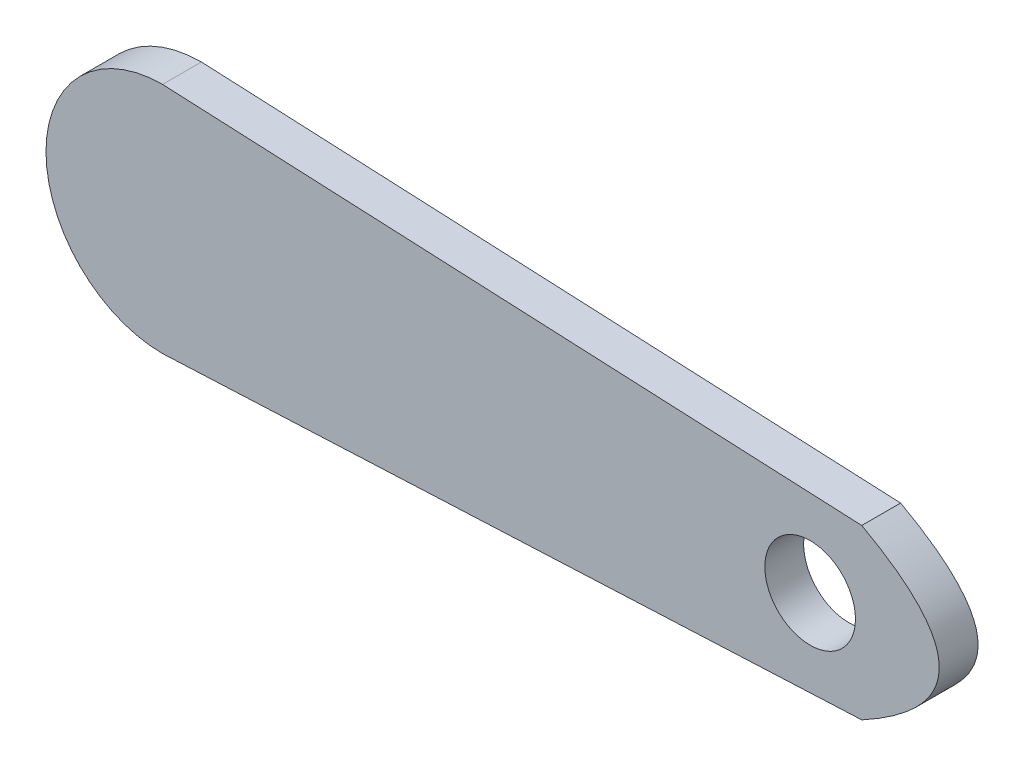
ISO-10303-21;
HEADER;
FILE_DESCRIPTION(('STEP AP214'),'2;1');
FILE_NAME('part.step','',(''),(''),'','','');
FILE_SCHEMA(('AUTOMOTIVE_DESIGN { 1 0 10303 214 1 1 1 1 }'));
ENDSEC;
DATA;
#1=APPLICATION_CONTEXT('core data for automotive mechanical design processes');
#2=APPLICATION_PROTOCOL_DEFINITION('international standard','automotive_design',2000,#1);
#3=PRODUCT_CONTEXT('',#1,'mechanical');
#4=PRODUCT('Part','Part','',(#3));
#5=PRODUCT_RELATED_PRODUCT_CATEGORY('part','',(#4));
#6=PRODUCT_DEFINITION_FORMATION('','',#4);
#7=PRODUCT_DEFINITION_CONTEXT('part definition',#1,'design');
#8=PRODUCT_DEFINITION('design','',#6,#7);
#9=PRODUCT_DEFINITION_SHAPE('','',#8);
#10=(LENGTH_UNIT() NAMED_UNIT(*) SI_UNIT(.MILLI.,.METRE.));
#11=(NAMED_UNIT(*) PLANE_ANGLE_UNIT() SI_UNIT($,.RADIAN.));
#12=(NAMED_UNIT(*) SI_UNIT($,.STERADIAN.) SOLID_ANGLE_UNIT());
#13=UNCERTAINTY_MEASURE_WITH_UNIT(LENGTH_MEASURE(1.E-05),#10,'distance_accuracy_value','');
#14=(GEOMETRIC_REPRESENTATION_CONTEXT(3) GLOBAL_UNCERTAINTY_ASSIGNED_CONTEXT((#13)) GLOBAL_UNIT_ASSIGNED_CONTEXT((#10,
#11,#12)) REPRESENTATION_CONTEXT('',''));
#15=CARTESIAN_POINT('',(0.,0.,0.));
#16=DIRECTION('',(0.,0.,1.));
#17=DIRECTION('',(1.,0.,0.));
#18=AXIS2_PLACEMENT_3D('',#15,#16,#17);
#19=CARTESIAN_POINT('',(-25.,0.,3.));
#20=DIRECTION('',(0.,0.,-1.));
#21=DIRECTION('',(-1.,0.,0.));
#22=AXIS2_PLACEMENT_3D('',#19,#20,#21);
#23=CYLINDRICAL_SURFACE('',#22,9.);
#24=CARTESIAN_POINT('',(-25.,0.,0.));
#25=DIRECTION('',(0.,0.,1.));
#26=DIRECTION('',(1.,0.,0.));
#27=AXIS2_PLACEMENT_3D('',#24,#25,#26);
#28=CIRCLE('',#27,9.);
#29=CARTESIAN_POINT('',(-25.,9.,0.));
#30=VERTEX_POINT('',#29);
#31=CARTESIAN_POINT('',(-25.,-9.,0.));
#32=VERTEX_POINT('',#31);
#33=EDGE_CURVE('E119',#30,#32,#28,.T.);
#34=ORIENTED_EDGE('',*,*,#33,.T.);
#35=DIRECTION('',(0.,0.,-1.));
#36=VECTOR('',#35,1.);
#37=CARTESIAN_POINT('',(-25.,-9.,3.));
#38=LINE('',#37,#36);
#39=CARTESIAN_POINT('',(-25.,-9.,3.));
#40=VERTEX_POINT('',#39);
#41=EDGE_CURVE('E11',#40,#32,#38,.T.);
#42=ORIENTED_EDGE('',*,*,#41,.F.);
#43=CARTESIAN_POINT('',(-25.,0.,3.));
#44=DIRECTION('',(0.,0.,1.));
#45=DIRECTION('',(1.,0.,0.));
#46=AXIS2_PLACEMENT_3D('',#43,#44,#45);
#47=CIRCLE('',#46,9.);
#48=CARTESIAN_POINT('',(-25.,9.,3.));
#49=VERTEX_POINT('',#48);
#50=EDGE_CURVE('E87',#49,#40,#47,.T.);
#51=ORIENTED_EDGE('',*,*,#50,.F.);
#52=DIRECTION('',(0.,0.,-1.));
#53=VECTOR('',#52,1.);
#54=CARTESIAN_POINT('',(-25.,9.,3.));
#55=LINE('',#54,#53);
#56=EDGE_CURVE('E53',#49,#30,#55,.T.);
#57=ORIENTED_EDGE('',*,*,#56,.T.);
#58=EDGE_LOOP('',(#34,#42,#51,#57));
#59=FACE_BOUND('',#58,.T.);
#60=ADVANCED_FACE('F37',(#59),#23,.T.);
#61=CARTESIAN_POINT('',(0.362388931263571,-7.82550010989451,3.));
#62=DIRECTION('',(-0.0462591500689257,0.998929472502889,0.));
#63=DIRECTION('',(-0.998929472502889,-0.0462591500689257,0.));
#64=AXIS2_PLACEMENT_3D('',#61,#62,#63);
#65=PLANE('',#64);
#66=DIRECTION('',(0.998929472502889,0.0462591500689257,0.));
#67=VECTOR('',#66,1.);
#68=CARTESIAN_POINT('',(0.362388931263571,-7.82550010989451,0.));
#69=LINE('',#68,#67);
#70=CARTESIAN_POINT('',(28.9855072463768,-6.5,0.));
#71=VERTEX_POINT('',#70);
#72=EDGE_CURVE('E92',#32,#71,#69,.T.);
#73=ORIENTED_EDGE('',*,*,#72,.T.);
#74=DIRECTION('',(0.,0.,-1.));
#75=VECTOR('',#74,1.);
#76=CARTESIAN_POINT('',(28.9855072463768,-6.5,3.));
#77=LINE('',#76,#75);
#78=CARTESIAN_POINT('',(28.9855072463768,-6.5,3.));
#79=VERTEX_POINT('',#78);
#80=EDGE_CURVE('E45',#79,#71,#77,.T.);
#81=ORIENTED_EDGE('',*,*,#80,.F.);
#82=DIRECTION('',(0.998929472502889,0.0462591500689257,0.));
#83=VECTOR('',#82,1.);
#84=CARTESIAN_POINT('',(0.362388931263571,-7.82550010989451,3.));
#85=LINE('',#84,#83);
#86=EDGE_CURVE('E78',#40,#79,#85,.T.);
#87=ORIENTED_EDGE('',*,*,#86,.F.);
#88=ORIENTED_EDGE('',*,*,#41,.T.);
#89=EDGE_LOOP('',(#73,#81,#87,#88));
#90=FACE_BOUND('',#89,.T.);
#91=ADVANCED_FACE('F91',(#90),#65,.F.);
#92=CARTESIAN_POINT('',(28.9855072463768,6.5,3.));
#93=CARTESIAN_POINT('',(40.9466828530367,0.,3.));
#94=CARTESIAN_POINT('',(28.9855072463768,-6.5,3.));
#95=B_SPLINE_CURVE_WITH_KNOTS('',2,(#92,#93,#94),.UNSPECIFIED.,.F.,.F.,(3,3),(0.,1.),.UNSPECIFIED.);
#96=DIRECTION('',(0.,0.,-1.));
#97=VECTOR('',#96,1.);
#98=SURFACE_OF_LINEAR_EXTRUSION('',#95,#97);
#99=CARTESIAN_POINT('',(28.9855072463768,6.5,0.));
#100=CARTESIAN_POINT('',(40.9466828530367,0.,0.));
#101=CARTESIAN_POINT('',(28.9855072463768,-6.5,0.));
#102=B_SPLINE_CURVE_WITH_KNOTS('',2,(#99,#100,#101),.UNSPECIFIED.,.F.,.F.,(3,3),(0.,1.),.UNSPECIFIED.);
#103=CARTESIAN_POINT('',(28.9855072463768,6.5,0.));
#104=VERTEX_POINT('',#103);
#105=EDGE_CURVE('E123',#104,#71,#102,.T.);
#106=ORIENTED_EDGE('',*,*,#105,.F.);
#107=DIRECTION('',(0.,0.,-1.));
#108=VECTOR('',#107,1.);
#109=CARTESIAN_POINT('',(28.9855072463768,6.5,3.));
#110=LINE('',#109,#108);
#111=CARTESIAN_POINT('',(28.9855072463768,6.5,3.));
#112=VERTEX_POINT('',#111);
#113=EDGE_CURVE('E67',#112,#104,#110,.T.);
#114=ORIENTED_EDGE('',*,*,#113,.F.);
#115=EDGE_CURVE('E86',#112,#79,#95,.T.);
#116=ORIENTED_EDGE('',*,*,#115,.T.);
#117=ORIENTED_EDGE('',*,*,#80,.T.);
#118=EDGE_LOOP('',(#106,#114,#116,#117));
#119=FACE_BOUND('',#118,.T.);
#120=ADVANCED_FACE('F95',(#119),#98,.T.);
#121=CARTESIAN_POINT('',(0.362388931263571,7.82550010989451,3.));
#122=DIRECTION('',(0.0462591500689257,0.998929472502889,0.));
#123=DIRECTION('',(-0.998929472502889,0.0462591500689257,0.));
#124=AXIS2_PLACEMENT_3D('',#121,#122,#123);
#125=PLANE('',#124);
#126=DIRECTION('',(0.998929472502889,-0.0462591500689257,0.));
#127=VECTOR('',#126,1.);
#128=CARTESIAN_POINT('',(0.362388931263571,7.82550010989451,0.));
#129=LINE('',#128,#127);
#130=EDGE_CURVE('E129',#30,#104,#129,.T.);
#131=ORIENTED_EDGE('',*,*,#130,.F.);
#132=ORIENTED_EDGE('',*,*,#56,.F.);
#133=DIRECTION('',(0.998929472502889,-0.0462591500689257,0.));
#134=VECTOR('',#133,1.);
#135=CARTESIAN_POINT('',(0.362388931263571,7.82550010989451,3.));
#136=LINE('',#135,#134);
#137=EDGE_CURVE('E96',#49,#112,#136,.T.);
#138=ORIENTED_EDGE('',*,*,#137,.T.);
#139=ORIENTED_EDGE('',*,*,#113,.T.);
#140=EDGE_LOOP('',(#131,#132,#138,#139));
#141=FACE_BOUND('',#140,.T.);
#142=ADVANCED_FACE('F111',(#141),#125,.T.);
#143=CARTESIAN_POINT('',(25.,0.,3.));
#144=DIRECTION('',(0.,0.,-1.));
#145=DIRECTION('',(-1.,0.,0.));
#146=AXIS2_PLACEMENT_3D('',#143,#144,#145);
#147=CYLINDRICAL_SURFACE('',#146,3.5);
#148=CARTESIAN_POINT('',(25.,0.,3.));
#149=DIRECTION('',(0.,0.,1.));
#150=DIRECTION('',(1.,0.,0.));
#151=AXIS2_PLACEMENT_3D('',#148,#149,#150);
#152=CIRCLE('',#151,3.5);
#153=CARTESIAN_POINT('',(28.5,0.,3.));
#154=VERTEX_POINT('',#153);
#155=EDGE_CURVE('E98',#154,#154,#152,.T.);
#156=ORIENTED_EDGE('',*,*,#155,.T.);
#157=EDGE_LOOP('',(#156));
#158=FACE_BOUND('',#157,.T.);
#159=CARTESIAN_POINT('',(25.,0.,0.));
#160=DIRECTION('',(0.,0.,1.));
#161=DIRECTION('',(1.,0.,0.));
#162=AXIS2_PLACEMENT_3D('',#159,#160,#161);
#163=CIRCLE('',#162,3.5);
#164=CARTESIAN_POINT('',(28.5,0.,0.));
#165=VERTEX_POINT('',#164);
#166=EDGE_CURVE('E134',#165,#165,#163,.T.);
#167=ORIENTED_EDGE('',*,*,#166,.F.);
#168=EDGE_LOOP('',(#167));
#169=FACE_BOUND('',#168,.T.);
#170=ADVANCED_FACE('F141',(#158,#169),#147,.F.);
#171=CARTESIAN_POINT('',(0.,0.,3.));
#172=DIRECTION('',(0.,0.,1.));
#173=DIRECTION('',(1.,0.,0.));
#174=AXIS2_PLACEMENT_3D('',#171,#172,#173);
#175=PLANE('',#174);
#176=ORIENTED_EDGE('',*,*,#50,.T.);
#177=ORIENTED_EDGE('',*,*,#86,.T.);
#178=ORIENTED_EDGE('',*,*,#115,.F.);
#179=ORIENTED_EDGE('',*,*,#137,.F.);
#180=EDGE_LOOP('',(#176,#177,#178,#179));
#181=FACE_BOUND('',#180,.T.);
#182=ORIENTED_EDGE('',*,*,#155,.F.);
#183=EDGE_LOOP('',(#182));
#184=FACE_BOUND('',#183,.T.);
#185=ADVANCED_FACE('F82',(#181,#184),#175,.T.);
#186=CARTESIAN_POINT('',(0.,0.,0.));
#187=DIRECTION('',(0.,0.,1.));
#188=DIRECTION('',(1.,0.,0.));
#189=AXIS2_PLACEMENT_3D('',#186,#187,#188);
#190=PLANE('',#189);
#191=ORIENTED_EDGE('',*,*,#33,.F.);
#192=ORIENTED_EDGE('',*,*,#130,.T.);
#193=ORIENTED_EDGE('',*,*,#105,.T.);
#194=ORIENTED_EDGE('',*,*,#72,.F.);
#195=EDGE_LOOP('',(#191,#192,#193,#194));
#196=FACE_BOUND('',#195,.T.);
#197=ORIENTED_EDGE('',*,*,#166,.T.);
#198=EDGE_LOOP('',(#197));
#199=FACE_BOUND('',#198,.T.);
#200=ADVANCED_FACE('F144',(#196,#199),#190,.F.);
#201=CLOSED_SHELL('',(#60,#91,#120,#142,#170,#185,#200));
#202=MANIFOLD_SOLID_BREP('B2',#201);
#203=ADVANCED_BREP_SHAPE_REPRESENTATION('',(#18,#202),#14);
#204=SHAPE_DEFINITION_REPRESENTATION(#9,#203);
ENDSEC;
END-ISO-10303-21;
